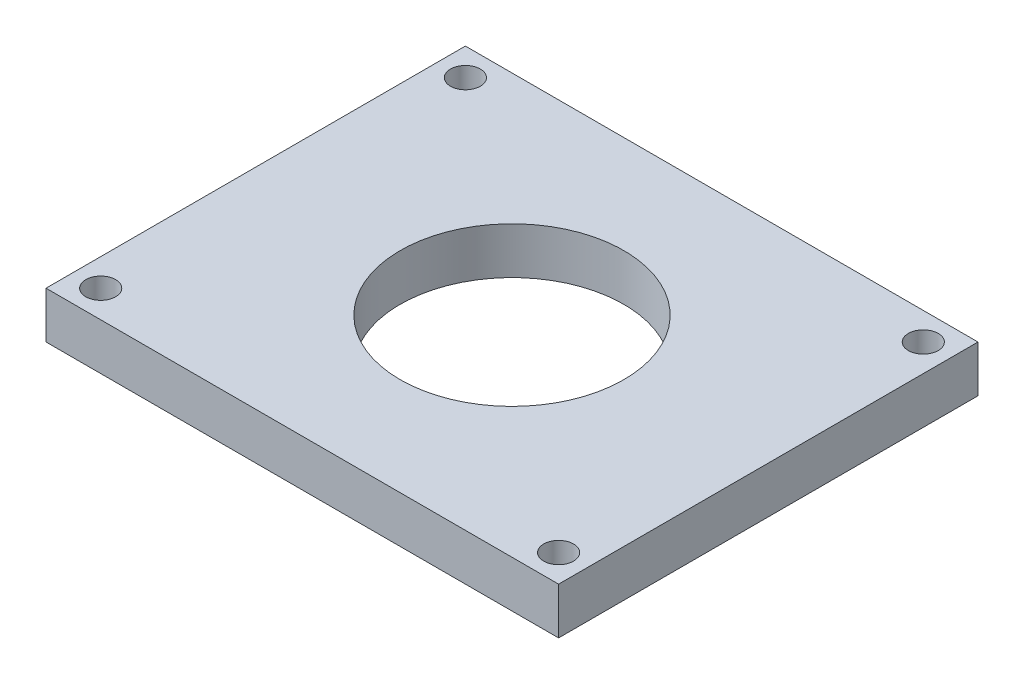
ISO-10303-21;
HEADER;
FILE_DESCRIPTION(('STEP AP214'),'2;1');
FILE_NAME('part.step','',(''),(''),'','','');
FILE_SCHEMA(('AUTOMOTIVE_DESIGN { 1 0 10303 214 1 1 1 1 }'));
ENDSEC;
DATA;
#1=APPLICATION_CONTEXT('core data for automotive mechanical design processes');
#2=APPLICATION_PROTOCOL_DEFINITION('international standard','automotive_design',2000,#1);
#3=PRODUCT_CONTEXT('',#1,'mechanical');
#4=PRODUCT('Part','Part','',(#3));
#5=PRODUCT_RELATED_PRODUCT_CATEGORY('part','',(#4));
#6=PRODUCT_DEFINITION_FORMATION('','',#4);
#7=PRODUCT_DEFINITION_CONTEXT('part definition',#1,'design');
#8=PRODUCT_DEFINITION('design','',#6,#7);
#9=PRODUCT_DEFINITION_SHAPE('','',#8);
#10=(LENGTH_UNIT() NAMED_UNIT(*) SI_UNIT(.MILLI.,.METRE.));
#11=(NAMED_UNIT(*) PLANE_ANGLE_UNIT() SI_UNIT($,.RADIAN.));
#12=(NAMED_UNIT(*) SI_UNIT($,.STERADIAN.) SOLID_ANGLE_UNIT());
#13=UNCERTAINTY_MEASURE_WITH_UNIT(LENGTH_MEASURE(1.E-05),#10,'distance_accuracy_value','');
#14=(GEOMETRIC_REPRESENTATION_CONTEXT(3) GLOBAL_UNCERTAINTY_ASSIGNED_CONTEXT((#13)) GLOBAL_UNIT_ASSIGNED_CONTEXT((#10,
#11,#12)) REPRESENTATION_CONTEXT('',''));
#15=CARTESIAN_POINT('',(0.,0.,0.));
#16=DIRECTION('',(0.,0.,1.));
#17=DIRECTION('',(1.,0.,0.));
#18=AXIS2_PLACEMENT_3D('',#15,#16,#17);
#19=CARTESIAN_POINT('',(0.,5.,45.));
#20=DIRECTION('',(1.,0.,0.));
#21=DIRECTION('',(0.,0.,-1.));
#22=AXIS2_PLACEMENT_3D('',#19,#20,#21);
#23=PLANE('',#22);
#24=DIRECTION('',(0.,0.,1.));
#25=VECTOR('',#24,1.);
#26=CARTESIAN_POINT('',(0.,0.,45.));
#27=LINE('',#26,#25);
#28=CARTESIAN_POINT('',(0.,0.,0.));
#29=VERTEX_POINT('',#28);
#30=CARTESIAN_POINT('',(0.,0.,45.));
#31=VERTEX_POINT('',#30);
#32=EDGE_CURVE('E103',#29,#31,#27,.T.);
#33=ORIENTED_EDGE('',*,*,#32,.T.);
#34=DIRECTION('',(0.,-1.,0.));
#35=VECTOR('',#34,1.);
#36=CARTESIAN_POINT('',(0.,5.,45.));
#37=LINE('',#36,#35);
#38=CARTESIAN_POINT('',(0.,5.,45.));
#39=VERTEX_POINT('',#38);
#40=EDGE_CURVE('E11',#39,#31,#37,.T.);
#41=ORIENTED_EDGE('',*,*,#40,.F.);
#42=DIRECTION('',(0.,0.,1.));
#43=VECTOR('',#42,1.);
#44=CARTESIAN_POINT('',(0.,5.,45.));
#45=LINE('',#44,#43);
#46=CARTESIAN_POINT('',(0.,5.,0.));
#47=VERTEX_POINT('',#46);
#48=EDGE_CURVE('E90',#47,#39,#45,.T.);
#49=ORIENTED_EDGE('',*,*,#48,.F.);
#50=DIRECTION('',(0.,-1.,0.));
#51=VECTOR('',#50,1.);
#52=CARTESIAN_POINT('',(0.,5.,0.));
#53=LINE('',#52,#51);
#54=EDGE_CURVE('E99',#47,#29,#53,.T.);
#55=ORIENTED_EDGE('',*,*,#54,.T.);
#56=EDGE_LOOP('',(#33,#41,#49,#55));
#57=FACE_BOUND('',#56,.T.);
#58=ADVANCED_FACE('F37',(#57),#23,.F.);
#59=CARTESIAN_POINT('',(55.,5.,45.));
#60=DIRECTION('',(0.,0.,-1.));
#61=DIRECTION('',(-1.,0.,0.));
#62=AXIS2_PLACEMENT_3D('',#59,#60,#61);
#63=PLANE('',#62);
#64=DIRECTION('',(1.,0.,0.));
#65=VECTOR('',#64,1.);
#66=CARTESIAN_POINT('',(55.,0.,45.));
#67=LINE('',#66,#65);
#68=CARTESIAN_POINT('',(55.,0.,45.));
#69=VERTEX_POINT('',#68);
#70=EDGE_CURVE('E94',#31,#69,#67,.T.);
#71=ORIENTED_EDGE('',*,*,#70,.T.);
#72=DIRECTION('',(0.,-1.,0.));
#73=VECTOR('',#72,1.);
#74=CARTESIAN_POINT('',(55.,5.,45.));
#75=LINE('',#74,#73);
#76=CARTESIAN_POINT('',(55.,5.,45.));
#77=VERTEX_POINT('',#76);
#78=EDGE_CURVE('E46',#77,#69,#75,.T.);
#79=ORIENTED_EDGE('',*,*,#78,.F.);
#80=DIRECTION('',(1.,0.,0.));
#81=VECTOR('',#80,1.);
#82=CARTESIAN_POINT('',(55.,5.,45.));
#83=LINE('',#82,#81);
#84=EDGE_CURVE('E85',#39,#77,#83,.T.);
#85=ORIENTED_EDGE('',*,*,#84,.F.);
#86=ORIENTED_EDGE('',*,*,#40,.T.);
#87=EDGE_LOOP('',(#71,#79,#85,#86));
#88=FACE_BOUND('',#87,.T.);
#89=ADVANCED_FACE('F93',(#88),#63,.F.);
#90=CARTESIAN_POINT('',(55.,5.,0.));
#91=DIRECTION('',(-1.,0.,0.));
#92=DIRECTION('',(0.,0.,1.));
#93=AXIS2_PLACEMENT_3D('',#90,#91,#92);
#94=PLANE('',#93);
#95=DIRECTION('',(0.,0.,-1.));
#96=VECTOR('',#95,1.);
#97=CARTESIAN_POINT('',(55.,0.,0.));
#98=LINE('',#97,#96);
#99=CARTESIAN_POINT('',(55.,0.,0.));
#100=VERTEX_POINT('',#99);
#101=EDGE_CURVE('E72',#69,#100,#98,.T.);
#102=ORIENTED_EDGE('',*,*,#101,.T.);
#103=DIRECTION('',(0.,-1.,0.));
#104=VECTOR('',#103,1.);
#105=CARTESIAN_POINT('',(55.,5.,0.));
#106=LINE('',#105,#104);
#107=CARTESIAN_POINT('',(55.,5.,0.));
#108=VERTEX_POINT('',#107);
#109=EDGE_CURVE('E95',#108,#100,#106,.T.);
#110=ORIENTED_EDGE('',*,*,#109,.F.);
#111=DIRECTION('',(0.,0.,-1.));
#112=VECTOR('',#111,1.);
#113=CARTESIAN_POINT('',(55.,5.,0.));
#114=LINE('',#113,#112);
#115=EDGE_CURVE('E88',#77,#108,#114,.T.);
#116=ORIENTED_EDGE('',*,*,#115,.F.);
#117=ORIENTED_EDGE('',*,*,#78,.T.);
#118=EDGE_LOOP('',(#102,#110,#116,#117));
#119=FACE_BOUND('',#118,.T.);
#120=ADVANCED_FACE('F97',(#119),#94,.F.);
#121=CARTESIAN_POINT('',(0.,5.,0.));
#122=DIRECTION('',(0.,0.,1.));
#123=DIRECTION('',(1.,0.,0.));
#124=AXIS2_PLACEMENT_3D('',#121,#122,#123);
#125=PLANE('',#124);
#126=DIRECTION('',(-1.,0.,0.));
#127=VECTOR('',#126,1.);
#128=CARTESIAN_POINT('',(0.,0.,0.));
#129=LINE('',#128,#127);
#130=EDGE_CURVE('E78',#100,#29,#129,.T.);
#131=ORIENTED_EDGE('',*,*,#130,.T.);
#132=ORIENTED_EDGE('',*,*,#54,.F.);
#133=DIRECTION('',(-1.,0.,0.));
#134=VECTOR('',#133,1.);
#135=CARTESIAN_POINT('',(0.,5.,0.));
#136=LINE('',#135,#134);
#137=EDGE_CURVE('E55',#108,#47,#136,.T.);
#138=ORIENTED_EDGE('',*,*,#137,.F.);
#139=ORIENTED_EDGE('',*,*,#109,.T.);
#140=EDGE_LOOP('',(#131,#132,#138,#139));
#141=FACE_BOUND('',#140,.T.);
#142=ADVANCED_FACE('F150',(#141),#125,.F.);
#143=CARTESIAN_POINT('',(0.,5.,0.));
#144=DIRECTION('',(0.,-1.,0.));
#145=DIRECTION('',(0.,0.,-1.));
#146=AXIS2_PLACEMENT_3D('',#143,#144,#145);
#147=PLANE('',#146);
#148=CARTESIAN_POINT('',(2.9352119940451,5.,42.0647880059549));
#149=DIRECTION('',(0.,1.,0.));
#150=DIRECTION('',(0.,0.,1.));
#151=AXIS2_PLACEMENT_3D('',#148,#149,#150);
#152=CIRCLE('',#151,1.6);
#153=CARTESIAN_POINT('',(2.9352119940451,5.,43.6647880059549));
#154=VERTEX_POINT('',#153);
#155=EDGE_CURVE('E136',#154,#154,#152,.T.);
#156=ORIENTED_EDGE('',*,*,#155,.F.);
#157=EDGE_LOOP('',(#156));
#158=FACE_BOUND('',#157,.T.);
#159=CARTESIAN_POINT('',(52.0647880059549,5.,42.0647880059549));
#160=DIRECTION('',(0.,1.,0.));
#161=DIRECTION('',(0.,0.,1.));
#162=AXIS2_PLACEMENT_3D('',#159,#160,#161);
#163=CIRCLE('',#162,1.6);
#164=CARTESIAN_POINT('',(52.0647880059549,5.,43.6647880059549));
#165=VERTEX_POINT('',#164);
#166=EDGE_CURVE('E139',#165,#165,#163,.T.);
#167=ORIENTED_EDGE('',*,*,#166,.F.);
#168=EDGE_LOOP('',(#167));
#169=FACE_BOUND('',#168,.T.);
#170=CARTESIAN_POINT('',(52.0647880059549,5.,2.9352119940451));
#171=DIRECTION('',(0.,1.,0.));
#172=DIRECTION('',(0.,0.,1.));
#173=AXIS2_PLACEMENT_3D('',#170,#171,#172);
#174=CIRCLE('',#173,1.6);
#175=CARTESIAN_POINT('',(52.0647880059549,5.,4.53521199404509));
#176=VERTEX_POINT('',#175);
#177=EDGE_CURVE('E135',#176,#176,#174,.T.);
#178=ORIENTED_EDGE('',*,*,#177,.F.);
#179=EDGE_LOOP('',(#178));
#180=FACE_BOUND('',#179,.T.);
#181=CARTESIAN_POINT('',(2.93521199404509,5.,2.9352119940451));
#182=DIRECTION('',(0.,1.,0.));
#183=DIRECTION('',(0.,0.,1.));
#184=AXIS2_PLACEMENT_3D('',#181,#182,#183);
#185=CIRCLE('',#184,1.6);
#186=CARTESIAN_POINT('',(2.93521199404509,5.,4.5352119940451));
#187=VERTEX_POINT('',#186);
#188=EDGE_CURVE('E116',#187,#187,#185,.T.);
#189=ORIENTED_EDGE('',*,*,#188,.F.);
#190=EDGE_LOOP('',(#189));
#191=FACE_BOUND('',#190,.T.);
#192=CARTESIAN_POINT('',(27.5,5.,22.5));
#193=DIRECTION('',(0.,1.,0.));
#194=DIRECTION('',(0.,0.,1.));
#195=AXIS2_PLACEMENT_3D('',#192,#193,#194);
#196=CIRCLE('',#195,12.);
#197=CARTESIAN_POINT('',(27.5,5.,34.5));
#198=VERTEX_POINT('',#197);
#199=EDGE_CURVE('E123',#198,#198,#196,.T.);
#200=ORIENTED_EDGE('',*,*,#199,.F.);
#201=EDGE_LOOP('',(#200));
#202=FACE_BOUND('',#201,.T.);
#203=ORIENTED_EDGE('',*,*,#48,.T.);
#204=ORIENTED_EDGE('',*,*,#84,.T.);
#205=ORIENTED_EDGE('',*,*,#115,.T.);
#206=ORIENTED_EDGE('',*,*,#137,.T.);
#207=EDGE_LOOP('',(#203,#204,#205,#206));
#208=FACE_BOUND('',#207,.T.);
#209=ADVANCED_FACE('F86',(#158,#169,#180,#191,#202,#208),#147,.F.);
#210=CARTESIAN_POINT('',(0.,0.,0.));
#211=DIRECTION('',(0.,-1.,0.));
#212=DIRECTION('',(0.,0.,-1.));
#213=AXIS2_PLACEMENT_3D('',#210,#211,#212);
#214=PLANE('',#213);
#215=CARTESIAN_POINT('',(2.9352119940451,0.,42.0647880059549));
#216=DIRECTION('',(0.,-1.,0.));
#217=DIRECTION('',(0.,0.,-1.));
#218=AXIS2_PLACEMENT_3D('',#215,#216,#217);
#219=CIRCLE('',#218,1.6);
#220=CARTESIAN_POINT('',(2.9352119940451,0.,40.4647880059549));
#221=VERTEX_POINT('',#220);
#222=EDGE_CURVE('E40',#221,#221,#219,.T.);
#223=ORIENTED_EDGE('',*,*,#222,.F.);
#224=EDGE_LOOP('',(#223));
#225=FACE_BOUND('',#224,.T.);
#226=CARTESIAN_POINT('',(52.0647880059549,0.,42.0647880059549));
#227=DIRECTION('',(0.,-1.,0.));
#228=DIRECTION('',(0.,0.,-1.));
#229=AXIS2_PLACEMENT_3D('',#226,#227,#228);
#230=CIRCLE('',#229,1.6);
#231=CARTESIAN_POINT('',(52.0647880059549,0.,40.4647880059549));
#232=VERTEX_POINT('',#231);
#233=EDGE_CURVE('E118',#232,#232,#230,.T.);
#234=ORIENTED_EDGE('',*,*,#233,.F.);
#235=EDGE_LOOP('',(#234));
#236=FACE_BOUND('',#235,.T.);
#237=CARTESIAN_POINT('',(52.0647880059549,0.,2.9352119940451));
#238=DIRECTION('',(0.,-1.,0.));
#239=DIRECTION('',(0.,0.,-1.));
#240=AXIS2_PLACEMENT_3D('',#237,#238,#239);
#241=CIRCLE('',#240,1.6);
#242=CARTESIAN_POINT('',(52.0647880059549,0.,1.3352119940451));
#243=VERTEX_POINT('',#242);
#244=EDGE_CURVE('E115',#243,#243,#241,.T.);
#245=ORIENTED_EDGE('',*,*,#244,.F.);
#246=EDGE_LOOP('',(#245));
#247=FACE_BOUND('',#246,.T.);
#248=CARTESIAN_POINT('',(2.93521199404509,0.,2.9352119940451));
#249=DIRECTION('',(0.,-1.,0.));
#250=DIRECTION('',(0.,0.,-1.));
#251=AXIS2_PLACEMENT_3D('',#248,#249,#250);
#252=CIRCLE('',#251,1.6);
#253=CARTESIAN_POINT('',(2.93521199404509,0.,1.3352119940451));
#254=VERTEX_POINT('',#253);
#255=EDGE_CURVE('E112',#254,#254,#252,.T.);
#256=ORIENTED_EDGE('',*,*,#255,.F.);
#257=EDGE_LOOP('',(#256));
#258=FACE_BOUND('',#257,.T.);
#259=CARTESIAN_POINT('',(27.5,0.,22.5));
#260=DIRECTION('',(0.,1.,0.));
#261=DIRECTION('',(0.,0.,1.));
#262=AXIS2_PLACEMENT_3D('',#259,#260,#261);
#263=CIRCLE('',#262,12.);
#264=CARTESIAN_POINT('',(27.5,0.,34.5));
#265=VERTEX_POINT('',#264);
#266=EDGE_CURVE('E106',#265,#265,#263,.T.);
#267=ORIENTED_EDGE('',*,*,#266,.T.);
#268=EDGE_LOOP('',(#267));
#269=FACE_BOUND('',#268,.T.);
#270=ORIENTED_EDGE('',*,*,#32,.F.);
#271=ORIENTED_EDGE('',*,*,#130,.F.);
#272=ORIENTED_EDGE('',*,*,#101,.F.);
#273=ORIENTED_EDGE('',*,*,#70,.F.);
#274=EDGE_LOOP('',(#270,#271,#272,#273));
#275=FACE_BOUND('',#274,.T.);
#276=ADVANCED_FACE('F149',(#225,#236,#247,#258,#269,#275),#214,.T.);
#277=CARTESIAN_POINT('',(27.5,0.,22.5));
#278=DIRECTION('',(0.,1.,0.));
#279=DIRECTION('',(0.,0.,1.));
#280=AXIS2_PLACEMENT_3D('',#277,#278,#279);
#281=CYLINDRICAL_SURFACE('',#280,12.);
#282=ORIENTED_EDGE('',*,*,#266,.F.);
#283=EDGE_LOOP('',(#282));
#284=FACE_BOUND('',#283,.T.);
#285=ORIENTED_EDGE('',*,*,#199,.T.);
#286=EDGE_LOOP('',(#285));
#287=FACE_BOUND('',#286,.T.);
#288=ADVANCED_FACE('F158',(#284,#287),#281,.F.);
#289=CARTESIAN_POINT('',(2.93521199404509,-5.,2.9352119940451));
#290=DIRECTION('',(0.,1.,0.));
#291=DIRECTION('',(0.,0.,1.));
#292=AXIS2_PLACEMENT_3D('',#289,#290,#291);
#293=CYLINDRICAL_SURFACE('',#292,1.6);
#294=ORIENTED_EDGE('',*,*,#255,.T.);
#295=EDGE_LOOP('',(#294));
#296=FACE_BOUND('',#295,.T.);
#297=ORIENTED_EDGE('',*,*,#188,.T.);
#298=EDGE_LOOP('',(#297));
#299=FACE_BOUND('',#298,.T.);
#300=ADVANCED_FACE('F156',(#296,#299),#293,.F.);
#301=CARTESIAN_POINT('',(52.0647880059549,-5.,2.9352119940451));
#302=DIRECTION('',(0.,1.,0.));
#303=DIRECTION('',(0.,0.,1.));
#304=AXIS2_PLACEMENT_3D('',#301,#302,#303);
#305=CYLINDRICAL_SURFACE('',#304,1.6);
#306=ORIENTED_EDGE('',*,*,#244,.T.);
#307=EDGE_LOOP('',(#306));
#308=FACE_BOUND('',#307,.T.);
#309=ORIENTED_EDGE('',*,*,#177,.T.);
#310=EDGE_LOOP('',(#309));
#311=FACE_BOUND('',#310,.T.);
#312=ADVANCED_FACE('F145',(#308,#311),#305,.F.);
#313=CARTESIAN_POINT('',(52.0647880059549,-5.,42.0647880059549));
#314=DIRECTION('',(0.,1.,0.));
#315=DIRECTION('',(0.,0.,1.));
#316=AXIS2_PLACEMENT_3D('',#313,#314,#315);
#317=CYLINDRICAL_SURFACE('',#316,1.6);
#318=ORIENTED_EDGE('',*,*,#233,.T.);
#319=EDGE_LOOP('',(#318));
#320=FACE_BOUND('',#319,.T.);
#321=ORIENTED_EDGE('',*,*,#166,.T.);
#322=EDGE_LOOP('',(#321));
#323=FACE_BOUND('',#322,.T.);
#324=ADVANCED_FACE('F165',(#320,#323),#317,.F.);
#325=CARTESIAN_POINT('',(2.9352119940451,-5.,42.0647880059549));
#326=DIRECTION('',(0.,1.,0.));
#327=DIRECTION('',(0.,0.,1.));
#328=AXIS2_PLACEMENT_3D('',#325,#326,#327);
#329=CYLINDRICAL_SURFACE('',#328,1.6);
#330=ORIENTED_EDGE('',*,*,#222,.T.);
#331=EDGE_LOOP('',(#330));
#332=FACE_BOUND('',#331,.T.);
#333=ORIENTED_EDGE('',*,*,#155,.T.);
#334=EDGE_LOOP('',(#333));
#335=FACE_BOUND('',#334,.T.);
#336=ADVANCED_FACE('F238',(#332,#335),#329,.F.);
#337=CLOSED_SHELL('',(#58,#89,#120,#142,#209,#276,#288,#300,#312,#324,#336));
#338=MANIFOLD_SOLID_BREP('B2',#337);
#339=ADVANCED_BREP_SHAPE_REPRESENTATION('',(#18,#338),#14);
#340=SHAPE_DEFINITION_REPRESENTATION(#9,#339);
ENDSEC;
END-ISO-10303-21;
